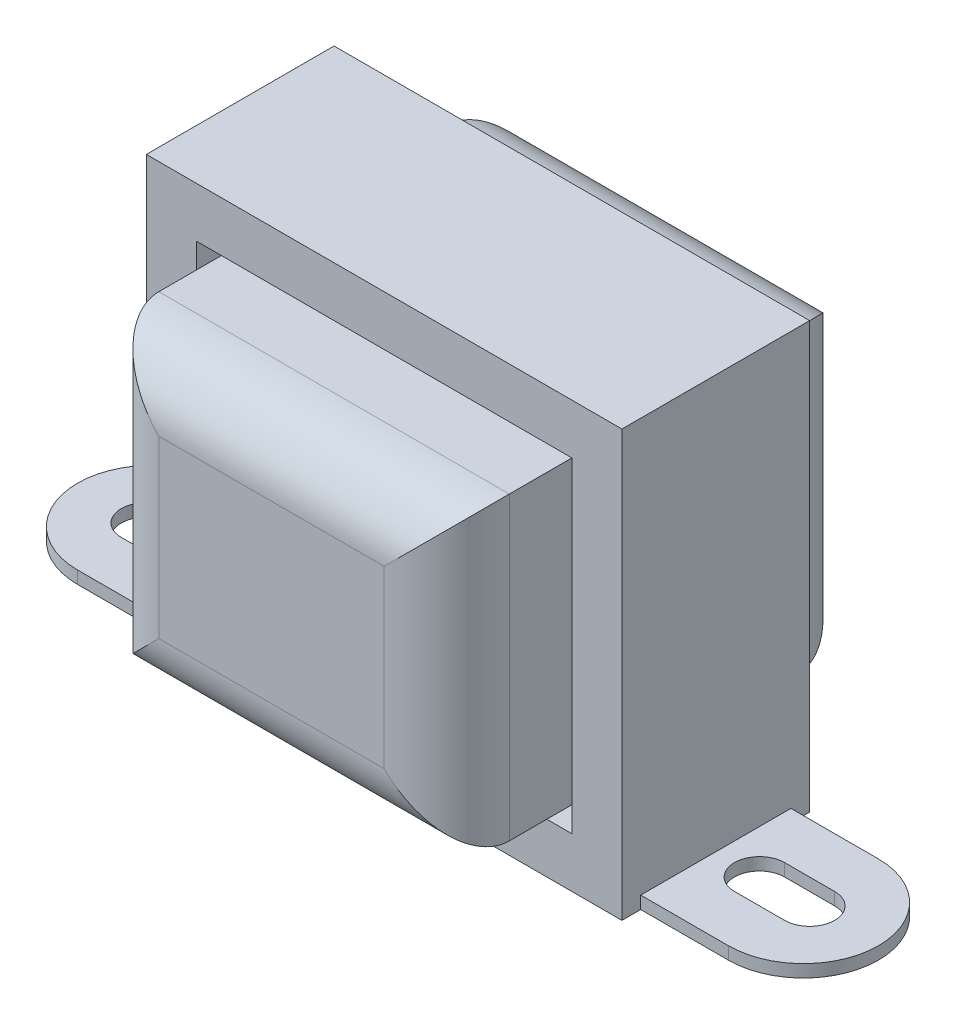
ISO-10303-21;
HEADER;
FILE_DESCRIPTION(('STEP AP214'),'2;1');
FILE_NAME('part.step','',(''),(''),'','','');
FILE_SCHEMA(('AUTOMOTIVE_DESIGN { 1 0 10303 214 1 1 1 1 }'));
ENDSEC;
DATA;
#1=APPLICATION_CONTEXT('core data for automotive mechanical design processes');
#2=APPLICATION_PROTOCOL_DEFINITION('international standard','automotive_design',2000,#1);
#3=PRODUCT_CONTEXT('',#1,'mechanical');
#4=PRODUCT('Part','Part','',(#3));
#5=PRODUCT_RELATED_PRODUCT_CATEGORY('part','',(#4));
#6=PRODUCT_DEFINITION_FORMATION('','',#4);
#7=PRODUCT_DEFINITION_CONTEXT('part definition',#1,'design');
#8=PRODUCT_DEFINITION('design','',#6,#7);
#9=PRODUCT_DEFINITION_SHAPE('','',#8);
#10=(LENGTH_UNIT() NAMED_UNIT(*) SI_UNIT(.MILLI.,.METRE.));
#11=(NAMED_UNIT(*) PLANE_ANGLE_UNIT() SI_UNIT($,.RADIAN.));
#12=(NAMED_UNIT(*) SI_UNIT($,.STERADIAN.) SOLID_ANGLE_UNIT());
#13=UNCERTAINTY_MEASURE_WITH_UNIT(LENGTH_MEASURE(1.E-05),#10,'distance_accuracy_value','');
#14=(GEOMETRIC_REPRESENTATION_CONTEXT(3) GLOBAL_UNCERTAINTY_ASSIGNED_CONTEXT((#13)) GLOBAL_UNIT_ASSIGNED_CONTEXT((#10,
#11,#12)) REPRESENTATION_CONTEXT('',''));
#15=CARTESIAN_POINT('',(0.,0.,0.));
#16=DIRECTION('',(0.,0.,1.));
#17=DIRECTION('',(1.,0.,0.));
#18=AXIS2_PLACEMENT_3D('',#15,#16,#17);
#19=CARTESIAN_POINT('',(14.,12.,16.5));
#20=DIRECTION('',(-1.,0.,0.));
#21=DIRECTION('',(0.,-1.,0.));
#22=AXIS2_PLACEMENT_3D('',#19,#20,#21);
#23=PLANE('',#22);
#24=DIRECTION('',(0.,0.,-1.));
#25=VECTOR('',#24,1.);
#26=CARTESIAN_POINT('',(14.,-12.,16.5));
#27=LINE('',#26,#25);
#28=CARTESIAN_POINT('',(14.,-12.,11.5));
#29=VERTEX_POINT('',#28);
#30=CARTESIAN_POINT('',(14.,-12.,-11.5));
#31=VERTEX_POINT('',#30);
#32=EDGE_CURVE('E172',#29,#31,#27,.T.);
#33=ORIENTED_EDGE('',*,*,#32,.T.);
#34=DIRECTION('',(0.,1.,0.));
#35=VECTOR('',#34,1.);
#36=CARTESIAN_POINT('',(14.,12.,-11.5));
#37=LINE('',#36,#35);
#38=CARTESIAN_POINT('',(14.,12.,-11.5));
#39=VERTEX_POINT('',#38);
#40=EDGE_CURVE('E186',#31,#39,#37,.T.);
#41=ORIENTED_EDGE('',*,*,#40,.T.);
#42=DIRECTION('',(0.,0.,-1.));
#43=VECTOR('',#42,1.);
#44=CARTESIAN_POINT('',(14.,12.,16.5));
#45=LINE('',#44,#43);
#46=CARTESIAN_POINT('',(14.,12.,11.5));
#47=VERTEX_POINT('',#46);
#48=EDGE_CURVE('E143',#47,#39,#45,.T.);
#49=ORIENTED_EDGE('',*,*,#48,.F.);
#50=DIRECTION('',(0.,1.,0.));
#51=VECTOR('',#50,1.);
#52=CARTESIAN_POINT('',(14.,-12.,11.5));
#53=LINE('',#52,#51);
#54=EDGE_CURVE('E189',#47,#29,#53,.F.);
#55=ORIENTED_EDGE('',*,*,#54,.T.);
#56=EDGE_LOOP('',(#33,#41,#49,#55));
#57=FACE_BOUND('',#56,.T.);
#58=ADVANCED_FACE('F53',(#57),#23,.F.);
#59=CARTESIAN_POINT('',(-14.,12.,16.5));
#60=DIRECTION('',(0.,-1.,0.));
#61=DIRECTION('',(0.,0.,-1.));
#62=AXIS2_PLACEMENT_3D('',#59,#60,#61);
#63=PLANE('',#62);
#64=ORIENTED_EDGE('',*,*,#48,.T.);
#65=DIRECTION('',(-1.,0.,0.));
#66=VECTOR('',#65,1.);
#67=CARTESIAN_POINT('',(-14.,12.,-11.5));
#68=LINE('',#67,#66);
#69=CARTESIAN_POINT('',(-14.,12.,-11.5));
#70=VERTEX_POINT('',#69);
#71=EDGE_CURVE('E141',#39,#70,#68,.T.);
#72=ORIENTED_EDGE('',*,*,#71,.T.);
#73=DIRECTION('',(0.,0.,-1.));
#74=VECTOR('',#73,1.);
#75=CARTESIAN_POINT('',(-14.,12.,16.5));
#76=LINE('',#75,#74);
#77=CARTESIAN_POINT('',(-14.,12.,11.5));
#78=VERTEX_POINT('',#77);
#79=EDGE_CURVE('E123',#78,#70,#76,.T.);
#80=ORIENTED_EDGE('',*,*,#79,.F.);
#81=DIRECTION('',(-1.,0.,0.));
#82=VECTOR('',#81,1.);
#83=CARTESIAN_POINT('',(14.,12.,11.5));
#84=LINE('',#83,#82);
#85=EDGE_CURVE('E138',#78,#47,#84,.F.);
#86=ORIENTED_EDGE('',*,*,#85,.T.);
#87=EDGE_LOOP('',(#64,#72,#80,#86));
#88=FACE_BOUND('',#87,.T.);
#89=ADVANCED_FACE('F137',(#88),#63,.F.);
#90=CARTESIAN_POINT('',(-14.,12.,16.5));
#91=DIRECTION('',(1.,0.,0.));
#92=DIRECTION('',(0.,1.,0.));
#93=AXIS2_PLACEMENT_3D('',#90,#91,#92);
#94=PLANE('',#93);
#95=ORIENTED_EDGE('',*,*,#79,.T.);
#96=DIRECTION('',(0.,-1.,0.));
#97=VECTOR('',#96,1.);
#98=CARTESIAN_POINT('',(-14.,12.,-11.5));
#99=LINE('',#98,#97);
#100=CARTESIAN_POINT('',(-14.,-12.,-11.5));
#101=VERTEX_POINT('',#100);
#102=EDGE_CURVE('E130',#70,#101,#99,.T.);
#103=ORIENTED_EDGE('',*,*,#102,.T.);
#104=DIRECTION('',(0.,0.,-1.));
#105=VECTOR('',#104,1.);
#106=CARTESIAN_POINT('',(-14.,-12.,16.5));
#107=LINE('',#106,#105);
#108=CARTESIAN_POINT('',(-14.,-12.,11.5));
#109=VERTEX_POINT('',#108);
#110=EDGE_CURVE('E125',#109,#101,#107,.T.);
#111=ORIENTED_EDGE('',*,*,#110,.F.);
#112=DIRECTION('',(0.,-1.,0.));
#113=VECTOR('',#112,1.);
#114=CARTESIAN_POINT('',(-14.,12.,11.5));
#115=LINE('',#114,#113);
#116=EDGE_CURVE('E120',#109,#78,#115,.F.);
#117=ORIENTED_EDGE('',*,*,#116,.T.);
#118=EDGE_LOOP('',(#95,#103,#111,#117));
#119=FACE_BOUND('',#118,.T.);
#120=ADVANCED_FACE('F122',(#119),#94,.F.);
#121=CARTESIAN_POINT('',(-14.,-12.,16.5));
#122=DIRECTION('',(0.,1.,0.));
#123=DIRECTION('',(0.,0.,1.));
#124=AXIS2_PLACEMENT_3D('',#121,#122,#123);
#125=PLANE('',#124);
#126=ORIENTED_EDGE('',*,*,#110,.T.);
#127=DIRECTION('',(1.,0.,0.));
#128=VECTOR('',#127,1.);
#129=CARTESIAN_POINT('',(-14.,-12.,-11.5));
#130=LINE('',#129,#128);
#131=EDGE_CURVE('E192',#101,#31,#130,.T.);
#132=ORIENTED_EDGE('',*,*,#131,.T.);
#133=ORIENTED_EDGE('',*,*,#32,.F.);
#134=DIRECTION('',(1.,0.,0.));
#135=VECTOR('',#134,1.);
#136=CARTESIAN_POINT('',(-14.,-12.,11.5));
#137=LINE('',#136,#135);
#138=EDGE_CURVE('E195',#29,#109,#137,.F.);
#139=ORIENTED_EDGE('',*,*,#138,.T.);
#140=EDGE_LOOP('',(#126,#132,#133,#139));
#141=FACE_BOUND('',#140,.T.);
#142=ADVANCED_FACE('F243',(#141),#125,.F.);
#143=CARTESIAN_POINT('',(0.,0.,16.5));
#144=DIRECTION('',(0.,0.,1.));
#145=DIRECTION('',(1.,0.,0.));
#146=AXIS2_PLACEMENT_3D('',#143,#144,#145);
#147=PLANE('',#146);
#148=DIRECTION('',(0.,-1.,0.));
#149=VECTOR('',#148,1.);
#150=CARTESIAN_POINT('',(-9.,-12.,16.5));
#151=LINE('',#150,#149);
#152=CARTESIAN_POINT('',(-9.00000000000001,7.,16.5));
#153=VERTEX_POINT('',#152);
#154=CARTESIAN_POINT('',(-9.,-7.,16.5));
#155=VERTEX_POINT('',#154);
#156=EDGE_CURVE('E63',#153,#155,#151,.T.);
#157=ORIENTED_EDGE('',*,*,#156,.T.);
#158=DIRECTION('',(1.,0.,0.));
#159=VECTOR('',#158,1.);
#160=CARTESIAN_POINT('',(14.,-7.,16.5));
#161=LINE('',#160,#159);
#162=CARTESIAN_POINT('',(9.,-7.,16.5));
#163=VERTEX_POINT('',#162);
#164=EDGE_CURVE('E12',#155,#163,#161,.T.);
#165=ORIENTED_EDGE('',*,*,#164,.T.);
#166=DIRECTION('',(0.,1.,0.));
#167=VECTOR('',#166,1.);
#168=CARTESIAN_POINT('',(9.,12.,16.5));
#169=LINE('',#168,#167);
#170=CARTESIAN_POINT('',(9.,7.,16.5));
#171=VERTEX_POINT('',#170);
#172=EDGE_CURVE('E183',#163,#171,#169,.T.);
#173=ORIENTED_EDGE('',*,*,#172,.T.);
#174=DIRECTION('',(-1.,0.,0.));
#175=VECTOR('',#174,1.);
#176=CARTESIAN_POINT('',(-14.,7.,16.5));
#177=LINE('',#176,#175);
#178=EDGE_CURVE('E74',#171,#153,#177,.T.);
#179=ORIENTED_EDGE('',*,*,#178,.T.);
#180=EDGE_LOOP('',(#157,#165,#173,#179));
#181=FACE_BOUND('',#180,.T.);
#182=ADVANCED_FACE('F249',(#181),#147,.T.);
#183=CARTESIAN_POINT('',(0.,0.,-16.5));
#184=DIRECTION('',(0.,0.,1.));
#185=DIRECTION('',(1.,0.,0.));
#186=AXIS2_PLACEMENT_3D('',#183,#184,#185);
#187=PLANE('',#186);
#188=DIRECTION('',(0.,-1.,0.));
#189=VECTOR('',#188,1.);
#190=CARTESIAN_POINT('',(-9.,0.,-16.5));
#191=LINE('',#190,#189);
#192=CARTESIAN_POINT('',(-9.,-7.,-16.5));
#193=VERTEX_POINT('',#192);
#194=CARTESIAN_POINT('',(-9.00000000000001,7.,-16.5));
#195=VERTEX_POINT('',#194);
#196=EDGE_CURVE('E203',#193,#195,#191,.F.);
#197=ORIENTED_EDGE('',*,*,#196,.T.);
#198=DIRECTION('',(-1.,0.,0.));
#199=VECTOR('',#198,1.);
#200=CARTESIAN_POINT('',(0.,7.,-16.5));
#201=LINE('',#200,#199);
#202=CARTESIAN_POINT('',(9.,7.,-16.5));
#203=VERTEX_POINT('',#202);
#204=EDGE_CURVE('E131',#195,#203,#201,.F.);
#205=ORIENTED_EDGE('',*,*,#204,.T.);
#206=DIRECTION('',(0.,1.,0.));
#207=VECTOR('',#206,1.);
#208=CARTESIAN_POINT('',(9.,0.,-16.5));
#209=LINE('',#208,#207);
#210=CARTESIAN_POINT('',(9.,-7.,-16.5));
#211=VERTEX_POINT('',#210);
#212=EDGE_CURVE('E209',#203,#211,#209,.F.);
#213=ORIENTED_EDGE('',*,*,#212,.T.);
#214=DIRECTION('',(1.,0.,0.));
#215=VECTOR('',#214,1.);
#216=CARTESIAN_POINT('',(0.,-7.,-16.5));
#217=LINE('',#216,#215);
#218=EDGE_CURVE('E206',#211,#193,#217,.F.);
#219=ORIENTED_EDGE('',*,*,#218,.T.);
#220=EDGE_LOOP('',(#197,#205,#213,#219));
#221=FACE_BOUND('',#220,.T.);
#222=ADVANCED_FACE('F251',(#221),#187,.F.);
#223=CARTESIAN_POINT('',(-14.,-7.,-11.5));
#224=DIRECTION('',(1.,0.,0.));
#225=DIRECTION('',(0.,0.,-1.));
#226=AXIS2_PLACEMENT_3D('',#223,#224,#225);
#227=CYLINDRICAL_SURFACE('',#226,5.);
#228=CARTESIAN_POINT('',(-9.,-7.,-11.5));
#229=DIRECTION('',(0.707106781186548,-0.707106781186547,0.));
#230=DIRECTION('',(0.707106781186547,0.707106781186548,0.));
#231=AXIS2_PLACEMENT_3D('',#228,#229,#230);
#232=ELLIPSE('',#231,7.07106781186547,5.);
#233=EDGE_CURVE('E173',#193,#101,#232,.F.);
#234=ORIENTED_EDGE('',*,*,#233,.F.);
#235=ORIENTED_EDGE('',*,*,#218,.F.);
#236=CARTESIAN_POINT('',(9.,-7.,-11.5));
#237=DIRECTION('',(0.707106781186547,0.707106781186548,0.));
#238=DIRECTION('',(-0.707106781186548,0.707106781186547,0.));
#239=AXIS2_PLACEMENT_3D('',#236,#237,#238);
#240=ELLIPSE('',#239,7.07106781186548,5.);
#241=EDGE_CURVE('E168',#31,#211,#240,.T.);
#242=ORIENTED_EDGE('',*,*,#241,.F.);
#243=ORIENTED_EDGE('',*,*,#131,.F.);
#244=EDGE_LOOP('',(#234,#235,#242,#243));
#245=FACE_BOUND('',#244,.T.);
#246=ADVANCED_FACE('F230',(#245),#227,.T.);
#247=CARTESIAN_POINT('',(9.,12.,-11.5));
#248=DIRECTION('',(0.,1.,0.));
#249=DIRECTION('',(-1.,0.,0.));
#250=AXIS2_PLACEMENT_3D('',#247,#248,#249);
#251=CYLINDRICAL_SURFACE('',#250,5.);
#252=ORIENTED_EDGE('',*,*,#241,.T.);
#253=ORIENTED_EDGE('',*,*,#212,.F.);
#254=CARTESIAN_POINT('',(9.,7.,-11.5));
#255=DIRECTION('',(-0.707106781186548,0.707106781186547,0.));
#256=DIRECTION('',(0.707106781186547,0.707106781186548,0.));
#257=AXIS2_PLACEMENT_3D('',#254,#255,#256);
#258=ELLIPSE('',#257,7.07106781186547,5.);
#259=EDGE_CURVE('E157',#39,#203,#258,.T.);
#260=ORIENTED_EDGE('',*,*,#259,.F.);
#261=ORIENTED_EDGE('',*,*,#40,.F.);
#262=EDGE_LOOP('',(#252,#253,#260,#261));
#263=FACE_BOUND('',#262,.T.);
#264=ADVANCED_FACE('F234',(#263),#251,.T.);
#265=CARTESIAN_POINT('',(-9.00000000000001,12.,-11.5));
#266=DIRECTION('',(0.,-1.,0.));
#267=DIRECTION('',(1.,0.,0.));
#268=AXIS2_PLACEMENT_3D('',#265,#266,#267);
#269=CYLINDRICAL_SURFACE('',#268,5.);
#270=ORIENTED_EDGE('',*,*,#233,.T.);
#271=ORIENTED_EDGE('',*,*,#102,.F.);
#272=CARTESIAN_POINT('',(-9.00000000000001,7.,-11.5));
#273=DIRECTION('',(-0.707106781186547,-0.707106781186548,0.));
#274=DIRECTION('',(0.707106781186548,-0.707106781186547,0.));
#275=AXIS2_PLACEMENT_3D('',#272,#273,#274);
#276=ELLIPSE('',#275,7.07106781186548,5.);
#277=EDGE_CURVE('E154',#195,#70,#276,.F.);
#278=ORIENTED_EDGE('',*,*,#277,.F.);
#279=ORIENTED_EDGE('',*,*,#196,.F.);
#280=EDGE_LOOP('',(#270,#271,#278,#279));
#281=FACE_BOUND('',#280,.T.);
#282=ADVANCED_FACE('F242',(#281),#269,.T.);
#283=CARTESIAN_POINT('',(-14.,7.,-11.5));
#284=DIRECTION('',(-1.,0.,0.));
#285=DIRECTION('',(0.,0.,1.));
#286=AXIS2_PLACEMENT_3D('',#283,#284,#285);
#287=CYLINDRICAL_SURFACE('',#286,5.);
#288=ORIENTED_EDGE('',*,*,#259,.T.);
#289=ORIENTED_EDGE('',*,*,#204,.F.);
#290=ORIENTED_EDGE('',*,*,#277,.T.);
#291=ORIENTED_EDGE('',*,*,#71,.F.);
#292=EDGE_LOOP('',(#288,#289,#290,#291));
#293=FACE_BOUND('',#292,.T.);
#294=ADVANCED_FACE('F237',(#293),#287,.T.);
#295=CARTESIAN_POINT('',(0.,7.,11.5));
#296=DIRECTION('',(1.,0.,0.));
#297=DIRECTION('',(0.,0.,-1.));
#298=AXIS2_PLACEMENT_3D('',#295,#296,#297);
#299=CYLINDRICAL_SURFACE('',#298,5.);
#300=CARTESIAN_POINT('',(9.,7.,11.5));
#301=DIRECTION('',(0.707106781186548,-0.707106781186547,0.));
#302=DIRECTION('',(-0.707106781186547,-0.707106781186548,0.));
#303=AXIS2_PLACEMENT_3D('',#300,#301,#302);
#304=ELLIPSE('',#303,7.07106781186547,5.);
#305=EDGE_CURVE('E148',#47,#171,#304,.T.);
#306=ORIENTED_EDGE('',*,*,#305,.F.);
#307=ORIENTED_EDGE('',*,*,#85,.F.);
#308=CARTESIAN_POINT('',(-9.00000000000001,7.,11.5));
#309=DIRECTION('',(0.707106781186547,0.707106781186548,0.));
#310=DIRECTION('',(0.707106781186548,-0.707106781186547,0.));
#311=AXIS2_PLACEMENT_3D('',#308,#309,#310);
#312=ELLIPSE('',#311,7.07106781186548,5.);
#313=EDGE_CURVE('E57',#153,#78,#312,.F.);
#314=ORIENTED_EDGE('',*,*,#313,.F.);
#315=ORIENTED_EDGE('',*,*,#178,.F.);
#316=EDGE_LOOP('',(#306,#307,#314,#315));
#317=FACE_BOUND('',#316,.T.);
#318=ADVANCED_FACE('F55',(#317),#299,.T.);
#319=CARTESIAN_POINT('',(-9.,0.,11.5));
#320=DIRECTION('',(0.,1.,0.));
#321=DIRECTION('',(-1.,0.,0.));
#322=AXIS2_PLACEMENT_3D('',#319,#320,#321);
#323=CYLINDRICAL_SURFACE('',#322,5.);
#324=ORIENTED_EDGE('',*,*,#313,.T.);
#325=ORIENTED_EDGE('',*,*,#116,.F.);
#326=CARTESIAN_POINT('',(-9.,-7.,11.5));
#327=DIRECTION('',(-0.707106781186548,0.707106781186547,0.));
#328=DIRECTION('',(0.707106781186547,0.707106781186548,0.));
#329=AXIS2_PLACEMENT_3D('',#326,#327,#328);
#330=ELLIPSE('',#329,7.07106781186547,5.);
#331=EDGE_CURVE('E159',#155,#109,#330,.F.);
#332=ORIENTED_EDGE('',*,*,#331,.F.);
#333=ORIENTED_EDGE('',*,*,#156,.F.);
#334=EDGE_LOOP('',(#324,#325,#332,#333));
#335=FACE_BOUND('',#334,.T.);
#336=ADVANCED_FACE('F152',(#335),#323,.T.);
#337=CARTESIAN_POINT('',(9.,0.,11.5));
#338=DIRECTION('',(0.,-1.,0.));
#339=DIRECTION('',(1.,0.,0.));
#340=AXIS2_PLACEMENT_3D('',#337,#338,#339);
#341=CYLINDRICAL_SURFACE('',#340,5.);
#342=ORIENTED_EDGE('',*,*,#305,.T.);
#343=ORIENTED_EDGE('',*,*,#172,.F.);
#344=CARTESIAN_POINT('',(9.,-7.,11.5));
#345=DIRECTION('',(-0.707106781186547,-0.707106781186548,0.));
#346=DIRECTION('',(0.707106781186548,-0.707106781186547,0.));
#347=AXIS2_PLACEMENT_3D('',#344,#345,#346);
#348=ELLIPSE('',#347,7.07106781186548,5.);
#349=EDGE_CURVE('E163',#29,#163,#348,.T.);
#350=ORIENTED_EDGE('',*,*,#349,.F.);
#351=ORIENTED_EDGE('',*,*,#54,.F.);
#352=EDGE_LOOP('',(#342,#343,#350,#351));
#353=FACE_BOUND('',#352,.T.);
#354=ADVANCED_FACE('F248',(#353),#341,.T.);
#355=CARTESIAN_POINT('',(0.,-7.,11.5));
#356=DIRECTION('',(-1.,0.,0.));
#357=DIRECTION('',(0.,0.,1.));
#358=AXIS2_PLACEMENT_3D('',#355,#356,#357);
#359=CYLINDRICAL_SURFACE('',#358,5.);
#360=ORIENTED_EDGE('',*,*,#331,.T.);
#361=ORIENTED_EDGE('',*,*,#138,.F.);
#362=ORIENTED_EDGE('',*,*,#349,.T.);
#363=ORIENTED_EDGE('',*,*,#164,.F.);
#364=EDGE_LOOP('',(#360,#361,#362,#363));
#365=FACE_BOUND('',#364,.T.);
#366=ADVANCED_FACE('F246',(#365),#359,.T.);
#367=CLOSED_SHELL('',(#58,#89,#120,#142,#182,#222,#246,#264,#282,#294,#318,#336,#354,#366));
#368=MANIFOLD_SOLID_BREP('B2',#367);
#369=CARTESIAN_POINT('',(-19.,17.,7.5));
#370=DIRECTION('',(1.,0.,0.));
#371=DIRECTION('',(0.,0.,-1.));
#372=AXIS2_PLACEMENT_3D('',#369,#370,#371);
#373=PLANE('',#372);
#374=DIRECTION('',(0.,-1.,0.));
#375=VECTOR('',#374,1.);
#376=CARTESIAN_POINT('',(-19.,-16.,-6.));
#377=LINE('',#376,#375);
#378=CARTESIAN_POINT('',(-19.,-16.,-6.));
#379=VERTEX_POINT('',#378);
#380=CARTESIAN_POINT('',(-19.,-17.,-6.));
#381=VERTEX_POINT('',#380);
#382=EDGE_CURVE('E674',#379,#381,#377,.T.);
#383=ORIENTED_EDGE('',*,*,#382,.F.);
#384=DIRECTION('',(0.,0.,-1.));
#385=VECTOR('',#384,1.);
#386=CARTESIAN_POINT('',(-19.,-16.,0.));
#387=LINE('',#386,#385);
#388=CARTESIAN_POINT('',(-19.,-16.,6.));
#389=VERTEX_POINT('',#388);
#390=EDGE_CURVE('E660',#389,#379,#387,.T.);
#391=ORIENTED_EDGE('',*,*,#390,.F.);
#392=DIRECTION('',(0.,-1.,0.));
#393=VECTOR('',#392,1.);
#394=CARTESIAN_POINT('',(-19.,-16.,6.));
#395=LINE('',#394,#393);
#396=CARTESIAN_POINT('',(-19.,-17.,6.));
#397=VERTEX_POINT('',#396);
#398=EDGE_CURVE('E670',#389,#397,#395,.T.);
#399=ORIENTED_EDGE('',*,*,#398,.T.);
#400=DIRECTION('',(0.,0.,-1.));
#401=VECTOR('',#400,1.);
#402=CARTESIAN_POINT('',(-19.,-17.,7.5));
#403=LINE('',#402,#401);
#404=CARTESIAN_POINT('',(-19.,-17.,7.5));
#405=VERTEX_POINT('',#404);
#406=EDGE_CURVE('E730',#405,#397,#403,.T.);
#407=ORIENTED_EDGE('',*,*,#406,.F.);
#408=DIRECTION('',(0.,-1.,0.));
#409=VECTOR('',#408,1.);
#410=CARTESIAN_POINT('',(-19.,17.,7.5));
#411=LINE('',#410,#409);
#412=CARTESIAN_POINT('',(-19.,17.,7.5));
#413=VERTEX_POINT('',#412);
#414=EDGE_CURVE('E712',#413,#405,#411,.T.);
#415=ORIENTED_EDGE('',*,*,#414,.F.);
#416=DIRECTION('',(0.,0.,-1.));
#417=VECTOR('',#416,1.);
#418=CARTESIAN_POINT('',(-19.,17.,7.5));
#419=LINE('',#418,#417);
#420=CARTESIAN_POINT('',(-19.,17.,-7.5));
#421=VERTEX_POINT('',#420);
#422=EDGE_CURVE('E401',#413,#421,#419,.T.);
#423=ORIENTED_EDGE('',*,*,#422,.T.);
#424=DIRECTION('',(0.,-1.,0.));
#425=VECTOR('',#424,1.);
#426=CARTESIAN_POINT('',(-19.,17.,-7.5));
#427=LINE('',#426,#425);
#428=CARTESIAN_POINT('',(-19.,-17.,-7.5));
#429=VERTEX_POINT('',#428);
#430=EDGE_CURVE('E721',#421,#429,#427,.T.);
#431=ORIENTED_EDGE('',*,*,#430,.T.);
#432=EDGE_CURVE('E729',#381,#429,#403,.T.);
#433=ORIENTED_EDGE('',*,*,#432,.F.);
#434=EDGE_LOOP('',(#383,#391,#399,#407,#415,#423,#431,#433));
#435=FACE_BOUND('',#434,.T.);
#436=ADVANCED_FACE('F393',(#435),#373,.F.);
#437=CARTESIAN_POINT('',(19.,17.,7.5));
#438=DIRECTION('',(-1.,0.,0.));
#439=DIRECTION('',(0.,0.,1.));
#440=AXIS2_PLACEMENT_3D('',#437,#438,#439);
#441=PLANE('',#440);
#442=DIRECTION('',(0.,-1.,0.));
#443=VECTOR('',#442,1.);
#444=CARTESIAN_POINT('',(19.,-16.,6.));
#445=LINE('',#444,#443);
#446=CARTESIAN_POINT('',(19.,-16.,6.));
#447=VERTEX_POINT('',#446);
#448=CARTESIAN_POINT('',(19.,-17.,6.));
#449=VERTEX_POINT('',#448);
#450=EDGE_CURVE('E702',#447,#449,#445,.T.);
#451=ORIENTED_EDGE('',*,*,#450,.F.);
#452=DIRECTION('',(0.,0.,1.));
#453=VECTOR('',#452,1.);
#454=CARTESIAN_POINT('',(19.,-16.,0.));
#455=LINE('',#454,#453);
#456=CARTESIAN_POINT('',(19.,-16.,-6.));
#457=VERTEX_POINT('',#456);
#458=EDGE_CURVE('E684',#457,#447,#455,.T.);
#459=ORIENTED_EDGE('',*,*,#458,.F.);
#460=DIRECTION('',(0.,-1.,0.));
#461=VECTOR('',#460,1.);
#462=CARTESIAN_POINT('',(19.,-16.,-6.));
#463=LINE('',#462,#461);
#464=CARTESIAN_POINT('',(19.,-17.,-6.));
#465=VERTEX_POINT('',#464);
#466=EDGE_CURVE('E699',#457,#465,#463,.T.);
#467=ORIENTED_EDGE('',*,*,#466,.T.);
#468=DIRECTION('',(0.,0.,-1.));
#469=VECTOR('',#468,1.);
#470=CARTESIAN_POINT('',(19.,-17.,7.5));
#471=LINE('',#470,#469);
#472=CARTESIAN_POINT('',(19.,-17.,-7.5));
#473=VERTEX_POINT('',#472);
#474=EDGE_CURVE('E716',#465,#473,#471,.T.);
#475=ORIENTED_EDGE('',*,*,#474,.T.);
#476=DIRECTION('',(0.,1.,0.));
#477=VECTOR('',#476,1.);
#478=CARTESIAN_POINT('',(19.,17.,-7.5));
#479=LINE('',#478,#477);
#480=CARTESIAN_POINT('',(19.,17.,-7.5));
#481=VERTEX_POINT('',#480);
#482=EDGE_CURVE('E698',#473,#481,#479,.T.);
#483=ORIENTED_EDGE('',*,*,#482,.T.);
#484=DIRECTION('',(0.,0.,-1.));
#485=VECTOR('',#484,1.);
#486=CARTESIAN_POINT('',(19.,17.,7.5));
#487=LINE('',#486,#485);
#488=CARTESIAN_POINT('',(19.,17.,7.5));
#489=VERTEX_POINT('',#488);
#490=EDGE_CURVE('E51',#489,#481,#487,.T.);
#491=ORIENTED_EDGE('',*,*,#490,.F.);
#492=DIRECTION('',(0.,1.,0.));
#493=VECTOR('',#492,1.);
#494=CARTESIAN_POINT('',(19.,17.,7.5));
#495=LINE('',#494,#493);
#496=CARTESIAN_POINT('',(19.,-17.,7.5));
#497=VERTEX_POINT('',#496);
#498=EDGE_CURVE('E706',#497,#489,#495,.T.);
#499=ORIENTED_EDGE('',*,*,#498,.F.);
#500=EDGE_CURVE('E726',#497,#449,#471,.T.);
#501=ORIENTED_EDGE('',*,*,#500,.T.);
#502=EDGE_LOOP('',(#451,#459,#467,#475,#483,#491,#499,#501));
#503=FACE_BOUND('',#502,.T.);
#504=ADVANCED_FACE('F395',(#503),#441,.F.);
#505=CARTESIAN_POINT('',(-19.,17.,7.5));
#506=DIRECTION('',(0.,-1.,0.));
#507=DIRECTION('',(0.,0.,-1.));
#508=AXIS2_PLACEMENT_3D('',#505,#506,#507);
#509=PLANE('',#508);
#510=DIRECTION('',(-1.,0.,0.));
#511=VECTOR('',#510,1.);
#512=CARTESIAN_POINT('',(-19.,17.,-7.5));
#513=LINE('',#512,#511);
#514=EDGE_CURVE('E719',#481,#421,#513,.T.);
#515=ORIENTED_EDGE('',*,*,#514,.T.);
#516=ORIENTED_EDGE('',*,*,#422,.F.);
#517=DIRECTION('',(-1.,0.,0.));
#518=VECTOR('',#517,1.);
#519=CARTESIAN_POINT('',(-19.,17.,7.5));
#520=LINE('',#519,#518);
#521=EDGE_CURVE('E709',#489,#413,#520,.T.);
#522=ORIENTED_EDGE('',*,*,#521,.F.);
#523=ORIENTED_EDGE('',*,*,#490,.T.);
#524=EDGE_LOOP('',(#515,#516,#522,#523));
#525=FACE_BOUND('',#524,.T.);
#526=ADVANCED_FACE('F766',(#525),#509,.F.);
#527=CARTESIAN_POINT('',(-19.,-17.,7.5));
#528=DIRECTION('',(0.,1.,0.));
#529=DIRECTION('',(0.,0.,1.));
#530=AXIS2_PLACEMENT_3D('',#527,#528,#529);
#531=PLANE('',#530);
#532=DIRECTION('',(-1.,0.,0.));
#533=VECTOR('',#532,1.);
#534=CARTESIAN_POINT('',(-22.4956250585868,-17.,2.));
#535=LINE('',#534,#533);
#536=CARTESIAN_POINT('',(-22.4956250585868,-17.,2.));
#537=VERTEX_POINT('',#536);
#538=CARTESIAN_POINT('',(-26.4956250585868,-17.,2.));
#539=VERTEX_POINT('',#538);
#540=EDGE_CURVE('E591',#537,#539,#535,.T.);
#541=ORIENTED_EDGE('',*,*,#540,.F.);
#542=CARTESIAN_POINT('',(-22.4956250585868,-17.,0.));
#543=DIRECTION('',(0.,1.,0.));
#544=DIRECTION('',(0.,0.,1.));
#545=AXIS2_PLACEMENT_3D('',#542,#543,#544);
#546=CIRCLE('',#545,2.);
#547=CARTESIAN_POINT('',(-22.4956250585868,-17.,-2.));
#548=VERTEX_POINT('',#547);
#549=EDGE_CURVE('E595',#548,#537,#546,.F.);
#550=ORIENTED_EDGE('',*,*,#549,.F.);
#551=DIRECTION('',(1.,0.,0.));
#552=VECTOR('',#551,1.);
#553=CARTESIAN_POINT('',(-22.4956250585868,-17.,-2.));
#554=LINE('',#553,#552);
#555=CARTESIAN_POINT('',(-26.4956250585868,-17.,-2.));
#556=VERTEX_POINT('',#555);
#557=EDGE_CURVE('E612',#556,#548,#554,.T.);
#558=ORIENTED_EDGE('',*,*,#557,.F.);
#559=CARTESIAN_POINT('',(-26.4956250585868,-17.,0.));
#560=DIRECTION('',(0.,1.,0.));
#561=DIRECTION('',(0.,0.,1.));
#562=AXIS2_PLACEMENT_3D('',#559,#560,#561);
#563=CIRCLE('',#562,2.);
#564=EDGE_CURVE('E589',#539,#556,#563,.F.);
#565=ORIENTED_EDGE('',*,*,#564,.F.);
#566=EDGE_LOOP('',(#541,#550,#558,#565));
#567=FACE_BOUND('',#566,.T.);
#568=DIRECTION('',(1.,0.,0.));
#569=VECTOR('',#568,1.);
#570=CARTESIAN_POINT('',(22.4956250585868,-17.,-2.));
#571=LINE('',#570,#569);
#572=CARTESIAN_POINT('',(22.4956250585868,-17.,-2.));
#573=VERTEX_POINT('',#572);
#574=CARTESIAN_POINT('',(26.4956250585868,-17.,-2.));
#575=VERTEX_POINT('',#574);
#576=EDGE_CURVE('E623',#573,#575,#571,.T.);
#577=ORIENTED_EDGE('',*,*,#576,.F.);
#578=CARTESIAN_POINT('',(22.4956250585868,-17.,0.));
#579=DIRECTION('',(0.,1.,0.));
#580=DIRECTION('',(0.,0.,1.));
#581=AXIS2_PLACEMENT_3D('',#578,#579,#580);
#582=CIRCLE('',#581,2.);
#583=CARTESIAN_POINT('',(22.4956250585868,-17.,2.));
#584=VERTEX_POINT('',#583);
#585=EDGE_CURVE('E626',#584,#573,#582,.F.);
#586=ORIENTED_EDGE('',*,*,#585,.F.);
#587=DIRECTION('',(-1.,0.,0.));
#588=VECTOR('',#587,1.);
#589=CARTESIAN_POINT('',(22.4956250585868,-17.,2.));
#590=LINE('',#589,#588);
#591=CARTESIAN_POINT('',(26.4956250585868,-17.,2.));
#592=VERTEX_POINT('',#591);
#593=EDGE_CURVE('E592',#592,#584,#590,.T.);
#594=ORIENTED_EDGE('',*,*,#593,.F.);
#595=CARTESIAN_POINT('',(26.4956250585868,-17.,0.));
#596=DIRECTION('',(0.,1.,0.));
#597=DIRECTION('',(0.,0.,1.));
#598=AXIS2_PLACEMENT_3D('',#595,#596,#597);
#599=CIRCLE('',#598,2.);
#600=EDGE_CURVE('E560',#575,#592,#599,.F.);
#601=ORIENTED_EDGE('',*,*,#600,.F.);
#602=EDGE_LOOP('',(#577,#586,#594,#601));
#603=FACE_BOUND('',#602,.T.);
#604=DIRECTION('',(1.,0.,0.));
#605=VECTOR('',#604,1.);
#606=CARTESIAN_POINT('',(-19.,-17.,-7.5));
#607=LINE('',#606,#605);
#608=EDGE_CURVE('E710',#429,#473,#607,.T.);
#609=ORIENTED_EDGE('',*,*,#608,.T.);
#610=ORIENTED_EDGE('',*,*,#474,.F.);
#611=DIRECTION('',(1.,0.,0.));
#612=VECTOR('',#611,1.);
#613=CARTESIAN_POINT('',(0.,-17.,-5.99999999999999));
#614=LINE('',#613,#612);
#615=CARTESIAN_POINT('',(26.,-17.,-6.));
#616=VERTEX_POINT('',#615);
#617=EDGE_CURVE('E682',#465,#616,#614,.T.);
#618=ORIENTED_EDGE('',*,*,#617,.T.);
#619=CARTESIAN_POINT('',(26.,-17.,0.));
#620=DIRECTION('',(0.,-1.,0.));
#621=DIRECTION('',(0.,0.,-1.));
#622=AXIS2_PLACEMENT_3D('',#619,#620,#621);
#623=CIRCLE('',#622,6.);
#624=CARTESIAN_POINT('',(26.,-17.,6.));
#625=VERTEX_POINT('',#624);
#626=EDGE_CURVE('E673',#625,#616,#623,.F.);
#627=ORIENTED_EDGE('',*,*,#626,.F.);
#628=DIRECTION('',(1.,0.,0.));
#629=VECTOR('',#628,1.);
#630=CARTESIAN_POINT('',(0.,-17.,6.));
#631=LINE('',#630,#629);
#632=EDGE_CURVE('E692',#449,#625,#631,.T.);
#633=ORIENTED_EDGE('',*,*,#632,.F.);
#634=ORIENTED_EDGE('',*,*,#500,.F.);
#635=DIRECTION('',(1.,0.,0.));
#636=VECTOR('',#635,1.);
#637=CARTESIAN_POINT('',(-19.,-17.,7.5));
#638=LINE('',#637,#636);
#639=EDGE_CURVE('E714',#405,#497,#638,.T.);
#640=ORIENTED_EDGE('',*,*,#639,.F.);
#641=ORIENTED_EDGE('',*,*,#406,.T.);
#642=DIRECTION('',(-1.,0.,0.));
#643=VECTOR('',#642,1.);
#644=CARTESIAN_POINT('',(0.,-17.,6.));
#645=LINE('',#644,#643);
#646=CARTESIAN_POINT('',(-26.,-17.,6.));
#647=VERTEX_POINT('',#646);
#648=EDGE_CURVE('E621',#397,#647,#645,.T.);
#649=ORIENTED_EDGE('',*,*,#648,.T.);
#650=CARTESIAN_POINT('',(-26.,-17.,0.));
#651=DIRECTION('',(0.,-1.,0.));
#652=DIRECTION('',(0.,0.,-1.));
#653=AXIS2_PLACEMENT_3D('',#650,#651,#652);
#654=CIRCLE('',#653,6.);
#655=CARTESIAN_POINT('',(-26.,-17.,-6.));
#656=VERTEX_POINT('',#655);
#657=EDGE_CURVE('E665',#647,#656,#654,.T.);
#658=ORIENTED_EDGE('',*,*,#657,.T.);
#659=DIRECTION('',(-1.,0.,0.));
#660=VECTOR('',#659,1.);
#661=CARTESIAN_POINT('',(0.,-17.,-5.99999999999999));
#662=LINE('',#661,#660);
#663=EDGE_CURVE('E655',#381,#656,#662,.T.);
#664=ORIENTED_EDGE('',*,*,#663,.F.);
#665=ORIENTED_EDGE('',*,*,#432,.T.);
#666=EDGE_LOOP('',(#609,#610,#618,#627,#633,#634,#640,#641,#649,#658,#664,#665));
#667=FACE_BOUND('',#666,.T.);
#668=ADVANCED_FACE('F747',(#567,#603,#667),#531,.F.);
#669=CARTESIAN_POINT('',(0.,0.,7.5));
#670=DIRECTION('',(0.,0.,1.));
#671=DIRECTION('',(1.,0.,0.));
#672=AXIS2_PLACEMENT_3D('',#669,#670,#671);
#673=PLANE('',#672);
#674=DIRECTION('',(0.,-1.,0.));
#675=VECTOR('',#674,1.);
#676=CARTESIAN_POINT('',(15.,-13.,7.5));
#677=LINE('',#676,#675);
#678=CARTESIAN_POINT('',(15.,13.,7.5));
#679=VERTEX_POINT('',#678);
#680=CARTESIAN_POINT('',(15.,-13.,7.5));
#681=VERTEX_POINT('',#680);
#682=EDGE_CURVE('E564',#679,#681,#677,.T.);
#683=ORIENTED_EDGE('',*,*,#682,.T.);
#684=DIRECTION('',(-1.,0.,0.));
#685=VECTOR('',#684,1.);
#686=CARTESIAN_POINT('',(-15.,-13.,7.5));
#687=LINE('',#686,#685);
#688=CARTESIAN_POINT('',(-15.,-13.,7.5));
#689=VERTEX_POINT('',#688);
#690=EDGE_CURVE('E553',#681,#689,#687,.T.);
#691=ORIENTED_EDGE('',*,*,#690,.T.);
#692=DIRECTION('',(0.,1.,0.));
#693=VECTOR('',#692,1.);
#694=CARTESIAN_POINT('',(-15.,-13.,7.5));
#695=LINE('',#694,#693);
#696=CARTESIAN_POINT('',(-15.,13.,7.5));
#697=VERTEX_POINT('',#696);
#698=EDGE_CURVE('E575',#689,#697,#695,.T.);
#699=ORIENTED_EDGE('',*,*,#698,.T.);
#700=DIRECTION('',(1.,0.,0.));
#701=VECTOR('',#700,1.);
#702=CARTESIAN_POINT('',(-15.,13.,7.5));
#703=LINE('',#702,#701);
#704=EDGE_CURVE('E571',#697,#679,#703,.T.);
#705=ORIENTED_EDGE('',*,*,#704,.T.);
#706=EDGE_LOOP('',(#683,#691,#699,#705));
#707=FACE_BOUND('',#706,.T.);
#708=ORIENTED_EDGE('',*,*,#498,.T.);
#709=ORIENTED_EDGE('',*,*,#521,.T.);
#710=ORIENTED_EDGE('',*,*,#414,.T.);
#711=ORIENTED_EDGE('',*,*,#639,.T.);
#712=EDGE_LOOP('',(#708,#709,#710,#711));
#713=FACE_BOUND('',#712,.T.);
#714=ADVANCED_FACE('F569',(#707,#713),#673,.T.);
#715=CARTESIAN_POINT('',(0.,0.,-7.5));
#716=DIRECTION('',(0.,0.,1.));
#717=DIRECTION('',(1.,0.,0.));
#718=AXIS2_PLACEMENT_3D('',#715,#716,#717);
#719=PLANE('',#718);
#720=DIRECTION('',(-1.,0.,0.));
#721=VECTOR('',#720,1.);
#722=CARTESIAN_POINT('',(-15.,-13.,-7.5));
#723=LINE('',#722,#721);
#724=CARTESIAN_POINT('',(15.,-13.,-7.5));
#725=VERTEX_POINT('',#724);
#726=CARTESIAN_POINT('',(-15.,-13.,-7.5));
#727=VERTEX_POINT('',#726);
#728=EDGE_CURVE('E573',#725,#727,#723,.T.);
#729=ORIENTED_EDGE('',*,*,#728,.F.);
#730=DIRECTION('',(0.,-1.,0.));
#731=VECTOR('',#730,1.);
#732=CARTESIAN_POINT('',(15.,-13.,-7.5));
#733=LINE('',#732,#731);
#734=CARTESIAN_POINT('',(15.,13.,-7.5));
#735=VERTEX_POINT('',#734);
#736=EDGE_CURVE('E416',#735,#725,#733,.T.);
#737=ORIENTED_EDGE('',*,*,#736,.F.);
#738=DIRECTION('',(1.,0.,0.));
#739=VECTOR('',#738,1.);
#740=CARTESIAN_POINT('',(-15.,13.,-7.5));
#741=LINE('',#740,#739);
#742=CARTESIAN_POINT('',(-15.,13.,-7.5));
#743=VERTEX_POINT('',#742);
#744=EDGE_CURVE('E566',#743,#735,#741,.T.);
#745=ORIENTED_EDGE('',*,*,#744,.F.);
#746=DIRECTION('',(0.,1.,0.));
#747=VECTOR('',#746,1.);
#748=CARTESIAN_POINT('',(-15.,-13.,-7.5));
#749=LINE('',#748,#747);
#750=EDGE_CURVE('E580',#727,#743,#749,.T.);
#751=ORIENTED_EDGE('',*,*,#750,.F.);
#752=EDGE_LOOP('',(#729,#737,#745,#751));
#753=FACE_BOUND('',#752,.T.);
#754=ORIENTED_EDGE('',*,*,#482,.F.);
#755=ORIENTED_EDGE('',*,*,#608,.F.);
#756=ORIENTED_EDGE('',*,*,#430,.F.);
#757=ORIENTED_EDGE('',*,*,#514,.F.);
#758=EDGE_LOOP('',(#754,#755,#756,#757));
#759=FACE_BOUND('',#758,.T.);
#760=ADVANCED_FACE('F744',(#753,#759),#719,.F.);
#761=CARTESIAN_POINT('',(26.,-16.,0.));
#762=DIRECTION('',(0.,-1.,0.));
#763=DIRECTION('',(0.,0.,-1.));
#764=AXIS2_PLACEMENT_3D('',#761,#762,#763);
#765=CYLINDRICAL_SURFACE('',#764,6.);
#766=ORIENTED_EDGE('',*,*,#626,.T.);
#767=DIRECTION('',(0.,-1.,0.));
#768=VECTOR('',#767,1.);
#769=CARTESIAN_POINT('',(26.,-16.,-6.));
#770=LINE('',#769,#768);
#771=CARTESIAN_POINT('',(26.,-16.,-6.));
#772=VERTEX_POINT('',#771);
#773=EDGE_CURVE('E696',#772,#616,#770,.T.);
#774=ORIENTED_EDGE('',*,*,#773,.F.);
#775=CARTESIAN_POINT('',(26.,-16.,0.));
#776=DIRECTION('',(0.,-1.,0.));
#777=DIRECTION('',(0.,0.,-1.));
#778=AXIS2_PLACEMENT_3D('',#775,#776,#777);
#779=CIRCLE('',#778,6.);
#780=CARTESIAN_POINT('',(26.,-16.,6.));
#781=VERTEX_POINT('',#780);
#782=EDGE_CURVE('E679',#781,#772,#779,.F.);
#783=ORIENTED_EDGE('',*,*,#782,.F.);
#784=DIRECTION('',(0.,-1.,0.));
#785=VECTOR('',#784,1.);
#786=CARTESIAN_POINT('',(26.,-16.,6.));
#787=LINE('',#786,#785);
#788=EDGE_CURVE('E689',#781,#625,#787,.T.);
#789=ORIENTED_EDGE('',*,*,#788,.T.);
#790=EDGE_LOOP('',(#766,#774,#783,#789));
#791=FACE_BOUND('',#790,.T.);
#792=ADVANCED_FACE('F780',(#791),#765,.T.);
#793=CARTESIAN_POINT('',(0.,-16.,-5.99999999999999));
#794=DIRECTION('',(0.,0.,-1.));
#795=DIRECTION('',(-1.,0.,0.));
#796=AXIS2_PLACEMENT_3D('',#793,#794,#795);
#797=PLANE('',#796);
#798=ORIENTED_EDGE('',*,*,#617,.F.);
#799=ORIENTED_EDGE('',*,*,#466,.F.);
#800=DIRECTION('',(1.,0.,0.));
#801=VECTOR('',#800,1.);
#802=CARTESIAN_POINT('',(0.,-16.,-5.99999999999999));
#803=LINE('',#802,#801);
#804=EDGE_CURVE('E686',#457,#772,#803,.T.);
#805=ORIENTED_EDGE('',*,*,#804,.T.);
#806=ORIENTED_EDGE('',*,*,#773,.T.);
#807=EDGE_LOOP('',(#798,#799,#805,#806));
#808=FACE_BOUND('',#807,.T.);
#809=ADVANCED_FACE('F772',(#808),#797,.T.);
#810=CARTESIAN_POINT('',(0.,-16.,6.));
#811=DIRECTION('',(0.,0.,-1.));
#812=DIRECTION('',(-1.,0.,0.));
#813=AXIS2_PLACEMENT_3D('',#810,#811,#812);
#814=PLANE('',#813);
#815=ORIENTED_EDGE('',*,*,#632,.T.);
#816=ORIENTED_EDGE('',*,*,#788,.F.);
#817=DIRECTION('',(1.,0.,0.));
#818=VECTOR('',#817,1.);
#819=CARTESIAN_POINT('',(0.,-16.,6.));
#820=LINE('',#819,#818);
#821=EDGE_CURVE('E681',#447,#781,#820,.T.);
#822=ORIENTED_EDGE('',*,*,#821,.F.);
#823=ORIENTED_EDGE('',*,*,#450,.T.);
#824=EDGE_LOOP('',(#815,#816,#822,#823));
#825=FACE_BOUND('',#824,.T.);
#826=ADVANCED_FACE('F783',(#825),#814,.F.);
#827=CARTESIAN_POINT('',(0.,-16.,0.));
#828=DIRECTION('',(0.,-1.,0.));
#829=DIRECTION('',(0.,0.,-1.));
#830=AXIS2_PLACEMENT_3D('',#827,#828,#829);
#831=PLANE('',#830);
#832=DIRECTION('',(1.,0.,0.));
#833=VECTOR('',#832,1.);
#834=CARTESIAN_POINT('',(22.4956250585868,-16.,2.));
#835=LINE('',#834,#833);
#836=CARTESIAN_POINT('',(22.4956250585868,-16.,2.));
#837=VERTEX_POINT('',#836);
#838=CARTESIAN_POINT('',(26.4956250585868,-16.,2.));
#839=VERTEX_POINT('',#838);
#840=EDGE_CURVE('E631',#837,#839,#835,.T.);
#841=ORIENTED_EDGE('',*,*,#840,.F.);
#842=CARTESIAN_POINT('',(22.4956250585868,-16.,0.));
#843=DIRECTION('',(0.,1.,0.));
#844=DIRECTION('',(0.,0.,-1.));
#845=AXIS2_PLACEMENT_3D('',#842,#843,#844);
#846=CIRCLE('',#845,2.);
#847=CARTESIAN_POINT('',(22.4956250585868,-16.,-2.));
#848=VERTEX_POINT('',#847);
#849=EDGE_CURVE('E629',#848,#837,#846,.T.);
#850=ORIENTED_EDGE('',*,*,#849,.F.);
#851=DIRECTION('',(-1.,0.,0.));
#852=VECTOR('',#851,1.);
#853=CARTESIAN_POINT('',(22.4956250585868,-16.,-2.));
#854=LINE('',#853,#852);
#855=CARTESIAN_POINT('',(26.4956250585868,-16.,-2.));
#856=VERTEX_POINT('',#855);
#857=EDGE_CURVE('E637',#856,#848,#854,.T.);
#858=ORIENTED_EDGE('',*,*,#857,.F.);
#859=CARTESIAN_POINT('',(26.4956250585868,-16.,0.));
#860=DIRECTION('',(0.,1.,0.));
#861=DIRECTION('',(0.,0.,-1.));
#862=AXIS2_PLACEMENT_3D('',#859,#860,#861);
#863=CIRCLE('',#862,2.);
#864=EDGE_CURVE('E634',#839,#856,#863,.T.);
#865=ORIENTED_EDGE('',*,*,#864,.F.);
#866=EDGE_LOOP('',(#841,#850,#858,#865));
#867=FACE_BOUND('',#866,.T.);
#868=ORIENTED_EDGE('',*,*,#782,.T.);
#869=ORIENTED_EDGE('',*,*,#804,.F.);
#870=ORIENTED_EDGE('',*,*,#458,.T.);
#871=ORIENTED_EDGE('',*,*,#821,.T.);
#872=EDGE_LOOP('',(#868,#869,#870,#871));
#873=FACE_BOUND('',#872,.T.);
#874=ADVANCED_FACE('F774',(#867,#873),#831,.F.);
#875=CARTESIAN_POINT('',(0.,-16.,6.));
#876=DIRECTION('',(0.,0.,1.));
#877=DIRECTION('',(1.,0.,0.));
#878=AXIS2_PLACEMENT_3D('',#875,#876,#877);
#879=PLANE('',#878);
#880=ORIENTED_EDGE('',*,*,#648,.F.);
#881=ORIENTED_EDGE('',*,*,#398,.F.);
#882=DIRECTION('',(-1.,0.,0.));
#883=VECTOR('',#882,1.);
#884=CARTESIAN_POINT('',(0.,-16.,6.));
#885=LINE('',#884,#883);
#886=CARTESIAN_POINT('',(-26.,-16.,6.));
#887=VERTEX_POINT('',#886);
#888=EDGE_CURVE('E651',#389,#887,#885,.T.);
#889=ORIENTED_EDGE('',*,*,#888,.T.);
#890=DIRECTION('',(0.,-1.,0.));
#891=VECTOR('',#890,1.);
#892=CARTESIAN_POINT('',(-26.,-16.,6.));
#893=LINE('',#892,#891);
#894=EDGE_CURVE('E662',#887,#647,#893,.T.);
#895=ORIENTED_EDGE('',*,*,#894,.T.);
#896=EDGE_LOOP('',(#880,#881,#889,#895));
#897=FACE_BOUND('',#896,.T.);
#898=ADVANCED_FACE('F759',(#897),#879,.T.);
#899=CARTESIAN_POINT('',(0.,-16.,-5.99999999999999));
#900=DIRECTION('',(0.,0.,1.));
#901=DIRECTION('',(1.,0.,0.));
#902=AXIS2_PLACEMENT_3D('',#899,#900,#901);
#903=PLANE('',#902);
#904=ORIENTED_EDGE('',*,*,#663,.T.);
#905=DIRECTION('',(0.,-1.,0.));
#906=VECTOR('',#905,1.);
#907=CARTESIAN_POINT('',(-26.,-16.,-6.));
#908=LINE('',#907,#906);
#909=CARTESIAN_POINT('',(-26.,-16.,-6.));
#910=VERTEX_POINT('',#909);
#911=EDGE_CURVE('E676',#910,#656,#908,.T.);
#912=ORIENTED_EDGE('',*,*,#911,.F.);
#913=DIRECTION('',(-1.,0.,0.));
#914=VECTOR('',#913,1.);
#915=CARTESIAN_POINT('',(0.,-16.,-5.99999999999999));
#916=LINE('',#915,#914);
#917=EDGE_CURVE('E658',#379,#910,#916,.T.);
#918=ORIENTED_EDGE('',*,*,#917,.F.);
#919=ORIENTED_EDGE('',*,*,#382,.T.);
#920=EDGE_LOOP('',(#904,#912,#918,#919));
#921=FACE_BOUND('',#920,.T.);
#922=ADVANCED_FACE('F752',(#921),#903,.F.);
#923=CARTESIAN_POINT('',(-26.,-16.,0.));
#924=DIRECTION('',(0.,-1.,0.));
#925=DIRECTION('',(0.,0.,-1.));
#926=AXIS2_PLACEMENT_3D('',#923,#924,#925);
#927=CYLINDRICAL_SURFACE('',#926,6.);
#928=ORIENTED_EDGE('',*,*,#657,.F.);
#929=ORIENTED_EDGE('',*,*,#894,.F.);
#930=CARTESIAN_POINT('',(-26.,-16.,0.));
#931=DIRECTION('',(0.,-1.,0.));
#932=DIRECTION('',(0.,0.,-1.));
#933=AXIS2_PLACEMENT_3D('',#930,#931,#932);
#934=CIRCLE('',#933,6.);
#935=EDGE_CURVE('E654',#887,#910,#934,.T.);
#936=ORIENTED_EDGE('',*,*,#935,.T.);
#937=ORIENTED_EDGE('',*,*,#911,.T.);
#938=EDGE_LOOP('',(#928,#929,#936,#937));
#939=FACE_BOUND('',#938,.T.);
#940=ADVANCED_FACE('F847',(#939),#927,.T.);
#941=CARTESIAN_POINT('',(0.,-16.,0.));
#942=DIRECTION('',(0.,-1.,0.));
#943=DIRECTION('',(0.,0.,-1.));
#944=AXIS2_PLACEMENT_3D('',#941,#942,#943);
#945=PLANE('',#944);
#946=DIRECTION('',(-1.,0.,0.));
#947=VECTOR('',#946,1.);
#948=CARTESIAN_POINT('',(-22.4956250585868,-16.,-2.));
#949=LINE('',#948,#947);
#950=CARTESIAN_POINT('',(-22.4956250585868,-16.,-2.));
#951=VERTEX_POINT('',#950);
#952=CARTESIAN_POINT('',(-26.4956250585868,-16.,-2.));
#953=VERTEX_POINT('',#952);
#954=EDGE_CURVE('E600',#951,#953,#949,.T.);
#955=ORIENTED_EDGE('',*,*,#954,.F.);
#956=CARTESIAN_POINT('',(-22.4956250585868,-16.,0.));
#957=DIRECTION('',(0.,1.,0.));
#958=DIRECTION('',(0.,0.,1.));
#959=AXIS2_PLACEMENT_3D('',#956,#957,#958);
#960=CIRCLE('',#959,2.);
#961=CARTESIAN_POINT('',(-22.4956250585868,-16.,2.));
#962=VERTEX_POINT('',#961);
#963=EDGE_CURVE('E598',#962,#951,#960,.T.);
#964=ORIENTED_EDGE('',*,*,#963,.F.);
#965=DIRECTION('',(1.,0.,0.));
#966=VECTOR('',#965,1.);
#967=CARTESIAN_POINT('',(-22.4956250585868,-16.,2.));
#968=LINE('',#967,#966);
#969=CARTESIAN_POINT('',(-26.4956250585868,-16.,2.));
#970=VERTEX_POINT('',#969);
#971=EDGE_CURVE('E606',#970,#962,#968,.T.);
#972=ORIENTED_EDGE('',*,*,#971,.F.);
#973=CARTESIAN_POINT('',(-26.4956250585868,-16.,0.));
#974=DIRECTION('',(0.,1.,0.));
#975=DIRECTION('',(0.,0.,1.));
#976=AXIS2_PLACEMENT_3D('',#973,#974,#975);
#977=CIRCLE('',#976,2.);
#978=EDGE_CURVE('E603',#953,#970,#977,.T.);
#979=ORIENTED_EDGE('',*,*,#978,.F.);
#980=EDGE_LOOP('',(#955,#964,#972,#979));
#981=FACE_BOUND('',#980,.T.);
#982=ORIENTED_EDGE('',*,*,#888,.F.);
#983=ORIENTED_EDGE('',*,*,#390,.T.);
#984=ORIENTED_EDGE('',*,*,#917,.T.);
#985=ORIENTED_EDGE('',*,*,#935,.F.);
#986=EDGE_LOOP('',(#982,#983,#984,#985));
#987=FACE_BOUND('',#986,.T.);
#988=ADVANCED_FACE('F757',(#981,#987),#945,.F.);
#989=CARTESIAN_POINT('',(-22.4956250585868,-17.001,0.));
#990=DIRECTION('',(0.,1.,0.));
#991=DIRECTION('',(0.,0.,1.));
#992=AXIS2_PLACEMENT_3D('',#989,#990,#991);
#993=CYLINDRICAL_SURFACE('',#992,2.);
#994=ORIENTED_EDGE('',*,*,#549,.T.);
#995=DIRECTION('',(0.,1.,0.));
#996=VECTOR('',#995,1.);
#997=CARTESIAN_POINT('',(-22.4956250585868,-17.001,2.));
#998=LINE('',#997,#996);
#999=EDGE_CURVE('E610',#537,#962,#998,.T.);
#1000=ORIENTED_EDGE('',*,*,#999,.T.);
#1001=ORIENTED_EDGE('',*,*,#963,.T.);
#1002=DIRECTION('',(0.,1.,0.));
#1003=VECTOR('',#1002,1.);
#1004=CARTESIAN_POINT('',(-22.4956250585868,-17.001,-2.));
#1005=LINE('',#1004,#1003);
#1006=EDGE_CURVE('E609',#548,#951,#1005,.T.);
#1007=ORIENTED_EDGE('',*,*,#1006,.F.);
#1008=EDGE_LOOP('',(#994,#1000,#1001,#1007));
#1009=FACE_BOUND('',#1008,.T.);
#1010=ADVANCED_FACE('F846',(#1009),#993,.F.);
#1011=CARTESIAN_POINT('',(-22.4956250585868,-17.001,2.));
#1012=DIRECTION('',(0.,0.,1.));
#1013=DIRECTION('',(1.,0.,0.));
#1014=AXIS2_PLACEMENT_3D('',#1011,#1012,#1013);
#1015=PLANE('',#1014);
#1016=ORIENTED_EDGE('',*,*,#540,.T.);
#1017=DIRECTION('',(0.,1.,0.));
#1018=VECTOR('',#1017,1.);
#1019=CARTESIAN_POINT('',(-26.4956250585868,-17.001,2.));
#1020=LINE('',#1019,#1018);
#1021=EDGE_CURVE('E613',#539,#970,#1020,.T.);
#1022=ORIENTED_EDGE('',*,*,#1021,.T.);
#1023=ORIENTED_EDGE('',*,*,#971,.T.);
#1024=ORIENTED_EDGE('',*,*,#999,.F.);
#1025=EDGE_LOOP('',(#1016,#1022,#1023,#1024));
#1026=FACE_BOUND('',#1025,.T.);
#1027=ADVANCED_FACE('F877',(#1026),#1015,.F.);
#1028=CARTESIAN_POINT('',(-26.4956250585868,-17.001,0.));
#1029=DIRECTION('',(0.,1.,0.));
#1030=DIRECTION('',(0.,0.,1.));
#1031=AXIS2_PLACEMENT_3D('',#1028,#1029,#1030);
#1032=CYLINDRICAL_SURFACE('',#1031,2.);
#1033=ORIENTED_EDGE('',*,*,#564,.T.);
#1034=DIRECTION('',(0.,1.,0.));
#1035=VECTOR('',#1034,1.);
#1036=CARTESIAN_POINT('',(-26.4956250585868,-17.001,-2.));
#1037=LINE('',#1036,#1035);
#1038=EDGE_CURVE('E615',#556,#953,#1037,.T.);
#1039=ORIENTED_EDGE('',*,*,#1038,.T.);
#1040=ORIENTED_EDGE('',*,*,#978,.T.);
#1041=ORIENTED_EDGE('',*,*,#1021,.F.);
#1042=EDGE_LOOP('',(#1033,#1039,#1040,#1041));
#1043=FACE_BOUND('',#1042,.T.);
#1044=ADVANCED_FACE('F884',(#1043),#1032,.F.);
#1045=CARTESIAN_POINT('',(-22.4956250585868,-17.001,-2.));
#1046=DIRECTION('',(0.,0.,-1.));
#1047=DIRECTION('',(-1.,0.,0.));
#1048=AXIS2_PLACEMENT_3D('',#1045,#1046,#1047);
#1049=PLANE('',#1048);
#1050=ORIENTED_EDGE('',*,*,#557,.T.);
#1051=ORIENTED_EDGE('',*,*,#1006,.T.);
#1052=ORIENTED_EDGE('',*,*,#954,.T.);
#1053=ORIENTED_EDGE('',*,*,#1038,.F.);
#1054=EDGE_LOOP('',(#1050,#1051,#1052,#1053));
#1055=FACE_BOUND('',#1054,.T.);
#1056=ADVANCED_FACE('F843',(#1055),#1049,.F.);
#1057=CARTESIAN_POINT('',(22.4956250585868,-17.001,0.));
#1058=DIRECTION('',(0.,1.,0.));
#1059=DIRECTION('',(0.,0.,1.));
#1060=AXIS2_PLACEMENT_3D('',#1057,#1058,#1059);
#1061=CYLINDRICAL_SURFACE('',#1060,2.);
#1062=ORIENTED_EDGE('',*,*,#585,.T.);
#1063=DIRECTION('',(0.,1.,0.));
#1064=VECTOR('',#1063,1.);
#1065=CARTESIAN_POINT('',(22.4956250585868,-17.001,-2.));
#1066=LINE('',#1065,#1064);
#1067=EDGE_CURVE('E641',#573,#848,#1066,.T.);
#1068=ORIENTED_EDGE('',*,*,#1067,.T.);
#1069=ORIENTED_EDGE('',*,*,#849,.T.);
#1070=DIRECTION('',(0.,1.,0.));
#1071=VECTOR('',#1070,1.);
#1072=CARTESIAN_POINT('',(22.4956250585868,-17.001,2.));
#1073=LINE('',#1072,#1071);
#1074=EDGE_CURVE('E640',#584,#837,#1073,.T.);
#1075=ORIENTED_EDGE('',*,*,#1074,.F.);
#1076=EDGE_LOOP('',(#1062,#1068,#1069,#1075));
#1077=FACE_BOUND('',#1076,.T.);
#1078=ADVANCED_FACE('F823',(#1077),#1061,.F.);
#1079=CARTESIAN_POINT('',(22.4956250585868,-17.001,-2.));
#1080=DIRECTION('',(0.,0.,-1.));
#1081=DIRECTION('',(-1.,0.,0.));
#1082=AXIS2_PLACEMENT_3D('',#1079,#1080,#1081);
#1083=PLANE('',#1082);
#1084=ORIENTED_EDGE('',*,*,#576,.T.);
#1085=DIRECTION('',(0.,1.,0.));
#1086=VECTOR('',#1085,1.);
#1087=CARTESIAN_POINT('',(26.4956250585868,-17.001,-2.));
#1088=LINE('',#1087,#1086);
#1089=EDGE_CURVE('E643',#575,#856,#1088,.T.);
#1090=ORIENTED_EDGE('',*,*,#1089,.T.);
#1091=ORIENTED_EDGE('',*,*,#857,.T.);
#1092=ORIENTED_EDGE('',*,*,#1067,.F.);
#1093=EDGE_LOOP('',(#1084,#1090,#1091,#1092));
#1094=FACE_BOUND('',#1093,.T.);
#1095=ADVANCED_FACE('F819',(#1094),#1083,.F.);
#1096=CARTESIAN_POINT('',(26.4956250585868,-17.001,0.));
#1097=DIRECTION('',(0.,1.,0.));
#1098=DIRECTION('',(0.,0.,1.));
#1099=AXIS2_PLACEMENT_3D('',#1096,#1097,#1098);
#1100=CYLINDRICAL_SURFACE('',#1099,2.);
#1101=ORIENTED_EDGE('',*,*,#600,.T.);
#1102=DIRECTION('',(0.,1.,0.));
#1103=VECTOR('',#1102,1.);
#1104=CARTESIAN_POINT('',(26.4956250585868,-17.001,2.));
#1105=LINE('',#1104,#1103);
#1106=EDGE_CURVE('E645',#592,#839,#1105,.T.);
#1107=ORIENTED_EDGE('',*,*,#1106,.T.);
#1108=ORIENTED_EDGE('',*,*,#864,.T.);
#1109=ORIENTED_EDGE('',*,*,#1089,.F.);
#1110=EDGE_LOOP('',(#1101,#1107,#1108,#1109));
#1111=FACE_BOUND('',#1110,.T.);
#1112=ADVANCED_FACE('F830',(#1111),#1100,.F.);
#1113=CARTESIAN_POINT('',(22.4956250585868,-17.001,2.));
#1114=DIRECTION('',(0.,0.,1.));
#1115=DIRECTION('',(1.,0.,0.));
#1116=AXIS2_PLACEMENT_3D('',#1113,#1114,#1115);
#1117=PLANE('',#1116);
#1118=ORIENTED_EDGE('',*,*,#593,.T.);
#1119=ORIENTED_EDGE('',*,*,#1074,.T.);
#1120=ORIENTED_EDGE('',*,*,#840,.T.);
#1121=ORIENTED_EDGE('',*,*,#1106,.F.);
#1122=EDGE_LOOP('',(#1118,#1119,#1120,#1121));
#1123=FACE_BOUND('',#1122,.T.);
#1124=ADVANCED_FACE('F827',(#1123),#1117,.F.);
#1125=CARTESIAN_POINT('',(15.,-13.,7.501));
#1126=DIRECTION('',(1.,0.,0.));
#1127=DIRECTION('',(0.,0.,-1.));
#1128=AXIS2_PLACEMENT_3D('',#1125,#1126,#1127);
#1129=PLANE('',#1128);
#1130=DIRECTION('',(0.,0.,-1.));
#1131=VECTOR('',#1130,1.);
#1132=CARTESIAN_POINT('',(15.,13.,7.501));
#1133=LINE('',#1132,#1131);
#1134=EDGE_CURVE('E561',#679,#735,#1133,.T.);
#1135=ORIENTED_EDGE('',*,*,#1134,.T.);
#1136=ORIENTED_EDGE('',*,*,#736,.T.);
#1137=DIRECTION('',(0.,0.,-1.));
#1138=VECTOR('',#1137,1.);
#1139=CARTESIAN_POINT('',(15.,-13.,7.501));
#1140=LINE('',#1139,#1138);
#1141=EDGE_CURVE('E555',#681,#725,#1140,.T.);
#1142=ORIENTED_EDGE('',*,*,#1141,.F.);
#1143=ORIENTED_EDGE('',*,*,#682,.F.);
#1144=EDGE_LOOP('',(#1135,#1136,#1142,#1143));
#1145=FACE_BOUND('',#1144,.T.);
#1146=ADVANCED_FACE('F563',(#1145),#1129,.F.);
#1147=CARTESIAN_POINT('',(-15.,13.,7.501));
#1148=DIRECTION('',(0.,1.,0.));
#1149=DIRECTION('',(-1.,0.,0.));
#1150=AXIS2_PLACEMENT_3D('',#1147,#1148,#1149);
#1151=PLANE('',#1150);
#1152=DIRECTION('',(0.,0.,-1.));
#1153=VECTOR('',#1152,1.);
#1154=CARTESIAN_POINT('',(-15.,13.,7.501));
#1155=LINE('',#1154,#1153);
#1156=EDGE_CURVE('E586',#697,#743,#1155,.T.);
#1157=ORIENTED_EDGE('',*,*,#1156,.T.);
#1158=ORIENTED_EDGE('',*,*,#744,.T.);
#1159=ORIENTED_EDGE('',*,*,#1134,.F.);
#1160=ORIENTED_EDGE('',*,*,#704,.F.);
#1161=EDGE_LOOP('',(#1157,#1158,#1159,#1160));
#1162=FACE_BOUND('',#1161,.T.);
#1163=ADVANCED_FACE('F944',(#1162),#1151,.F.);
#1164=CARTESIAN_POINT('',(-15.,-13.,7.501));
#1165=DIRECTION('',(-1.,0.,0.));
#1166=DIRECTION('',(0.,0.,1.));
#1167=AXIS2_PLACEMENT_3D('',#1164,#1165,#1166);
#1168=PLANE('',#1167);
#1169=DIRECTION('',(0.,0.,-1.));
#1170=VECTOR('',#1169,1.);
#1171=CARTESIAN_POINT('',(-15.,-13.,7.501));
#1172=LINE('',#1171,#1170);
#1173=EDGE_CURVE('E408',#689,#727,#1172,.T.);
#1174=ORIENTED_EDGE('',*,*,#1173,.T.);
#1175=ORIENTED_EDGE('',*,*,#750,.T.);
#1176=ORIENTED_EDGE('',*,*,#1156,.F.);
#1177=ORIENTED_EDGE('',*,*,#698,.F.);
#1178=EDGE_LOOP('',(#1174,#1175,#1176,#1177));
#1179=FACE_BOUND('',#1178,.T.);
#1180=ADVANCED_FACE('F953',(#1179),#1168,.F.);
#1181=CARTESIAN_POINT('',(-15.,-13.,7.501));
#1182=DIRECTION('',(0.,-1.,0.));
#1183=DIRECTION('',(1.,0.,0.));
#1184=AXIS2_PLACEMENT_3D('',#1181,#1182,#1183);
#1185=PLANE('',#1184);
#1186=ORIENTED_EDGE('',*,*,#1141,.T.);
#1187=ORIENTED_EDGE('',*,*,#728,.T.);
#1188=ORIENTED_EDGE('',*,*,#1173,.F.);
#1189=ORIENTED_EDGE('',*,*,#690,.F.);
#1190=EDGE_LOOP('',(#1186,#1187,#1188,#1189));
#1191=FACE_BOUND('',#1190,.T.);
#1192=ADVANCED_FACE('F554',(#1191),#1185,.F.);
#1193=CLOSED_SHELL('',(#436,#504,#526,#668,#714,#760,#792,#809,#826,#874,#898,#922,#940,#988,
#1010,#1027,#1044,#1056,#1078,#1095,#1112,#1124,#1146,#1163,#1180,#1192));
#1194=MANIFOLD_SOLID_BREP('B6',#1193);
#1195=ADVANCED_BREP_SHAPE_REPRESENTATION('',(#18,#368,#1194),#14);
#1196=SHAPE_DEFINITION_REPRESENTATION(#9,#1195);
ENDSEC;
END-ISO-10303-21;
